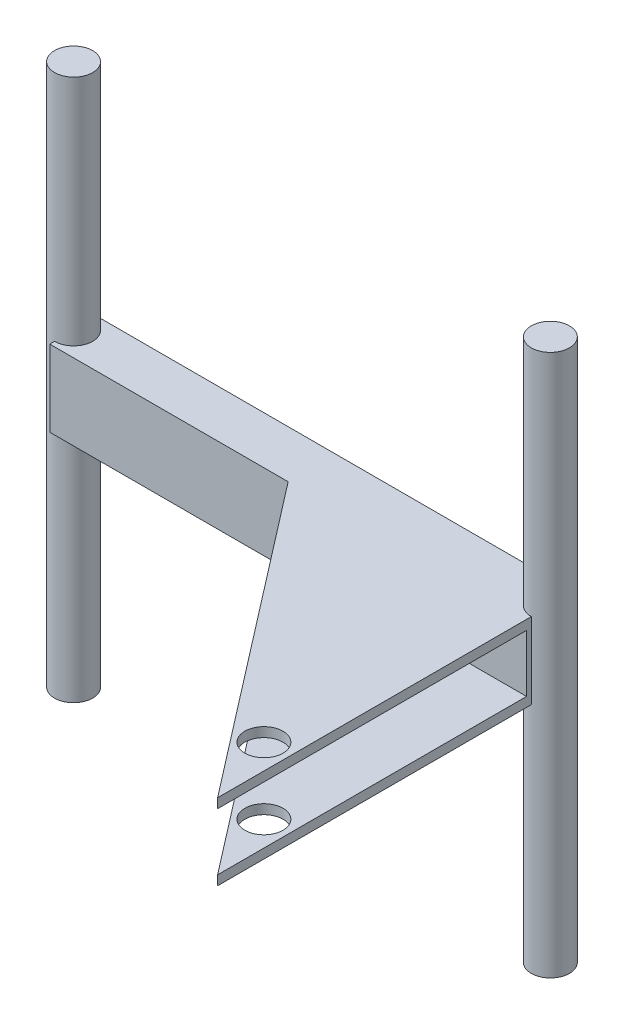
ISO-10303-21;
HEADER;
FILE_DESCRIPTION(('STEP AP214'),'2;1');
FILE_NAME('part.step','',(''),(''),'','','');
FILE_SCHEMA(('AUTOMOTIVE_DESIGN { 1 0 10303 214 1 1 1 1 }'));
ENDSEC;
DATA;
#1=APPLICATION_CONTEXT('core data for automotive mechanical design processes');
#2=APPLICATION_PROTOCOL_DEFINITION('international standard','automotive_design',2000,#1);
#3=PRODUCT_CONTEXT('',#1,'mechanical');
#4=PRODUCT('Part','Part','',(#3));
#5=PRODUCT_RELATED_PRODUCT_CATEGORY('part','',(#4));
#6=PRODUCT_DEFINITION_FORMATION('','',#4);
#7=PRODUCT_DEFINITION_CONTEXT('part definition',#1,'design');
#8=PRODUCT_DEFINITION('design','',#6,#7);
#9=PRODUCT_DEFINITION_SHAPE('','',#8);
#10=(LENGTH_UNIT() NAMED_UNIT(*) SI_UNIT(.MILLI.,.METRE.));
#11=(NAMED_UNIT(*) PLANE_ANGLE_UNIT() SI_UNIT($,.RADIAN.));
#12=(NAMED_UNIT(*) SI_UNIT($,.STERADIAN.) SOLID_ANGLE_UNIT());
#13=UNCERTAINTY_MEASURE_WITH_UNIT(LENGTH_MEASURE(1.E-05),#10,'distance_accuracy_value','');
#14=(GEOMETRIC_REPRESENTATION_CONTEXT(3) GLOBAL_UNCERTAINTY_ASSIGNED_CONTEXT((#13)) GLOBAL_UNIT_ASSIGNED_CONTEXT((#10,
#11,#12)) REPRESENTATION_CONTEXT('',''));
#15=CARTESIAN_POINT('',(0.,0.,0.));
#16=DIRECTION('',(0.,0.,1.));
#17=DIRECTION('',(1.,0.,0.));
#18=AXIS2_PLACEMENT_3D('',#15,#16,#17);
#19=CARTESIAN_POINT('',(-158.590308370044,43.7775330396476,50.));
#20=DIRECTION('',(1.,0.,0.));
#21=DIRECTION('',(0.,1.,0.));
#22=AXIS2_PLACEMENT_3D('',#19,#20,#21);
#23=PLANE('',#22);
#24=DIRECTION('',(0.,0.,-1.));
#25=VECTOR('',#24,1.);
#26=CARTESIAN_POINT('',(-158.590308370044,-36.2224669603524,50.));
#27=LINE('',#26,#25);
#28=CARTESIAN_POINT('',(-158.590308370044,-36.2224669603524,5.00000000000002));
#29=VERTEX_POINT('',#28);
#30=CARTESIAN_POINT('',(-158.590308370044,-36.2224669603524,0.));
#31=VERTEX_POINT('',#30);
#32=EDGE_CURVE('E231',#29,#31,#27,.T.);
#33=ORIENTED_EDGE('',*,*,#32,.F.);
#34=DIRECTION('',(0.,1.,0.));
#35=VECTOR('',#34,1.);
#36=CARTESIAN_POINT('',(-158.590308370044,-280.322466960352,5.00000000000002));
#37=LINE('',#36,#35);
#38=CARTESIAN_POINT('',(-158.590308370044,43.7775330396475,5.00000000000001));
#39=VERTEX_POINT('',#38);
#40=EDGE_CURVE('E195',#29,#39,#37,.T.);
#41=ORIENTED_EDGE('',*,*,#40,.T.);
#42=DIRECTION('',(0.,0.,-1.));
#43=VECTOR('',#42,1.);
#44=CARTESIAN_POINT('',(-158.590308370044,43.7775330396476,50.));
#45=LINE('',#44,#43);
#46=CARTESIAN_POINT('',(-158.590308370044,43.7775330396476,0.));
#47=VERTEX_POINT('',#46);
#48=EDGE_CURVE('E212',#39,#47,#45,.T.);
#49=ORIENTED_EDGE('',*,*,#48,.T.);
#50=DIRECTION('',(0.,-1.,0.));
#51=VECTOR('',#50,1.);
#52=CARTESIAN_POINT('',(-158.590308370044,43.7775330396476,0.));
#53=LINE('',#52,#51);
#54=EDGE_CURVE('E201',#47,#31,#53,.T.);
#55=ORIENTED_EDGE('',*,*,#54,.T.);
#56=EDGE_LOOP('',(#33,#41,#49,#55));
#57=FACE_BOUND('',#56,.T.);
#58=ADVANCED_FACE('F39',(#57),#23,.F.);
#59=CARTESIAN_POINT('',(341.409691629956,43.7775330396476,50.));
#60=DIRECTION('',(-1.,0.,0.));
#61=DIRECTION('',(0.,0.,1.));
#62=AXIS2_PLACEMENT_3D('',#59,#60,#61);
#63=PLANE('',#62);
#64=DIRECTION('',(0.,0.,-1.));
#65=VECTOR('',#64,1.);
#66=CARTESIAN_POINT('',(341.409691629956,-36.2224669603524,50.));
#67=LINE('',#66,#65);
#68=CARTESIAN_POINT('',(341.409691629956,-36.2224669603524,374.));
#69=VERTEX_POINT('',#68);
#70=CARTESIAN_POINT('',(341.409691629956,-36.2224669603524,45.));
#71=VERTEX_POINT('',#70);
#72=EDGE_CURVE('E229',#69,#71,#67,.T.);
#73=ORIENTED_EDGE('',*,*,#72,.T.);
#74=DIRECTION('',(0.,1.,0.));
#75=VECTOR('',#74,1.);
#76=CARTESIAN_POINT('',(341.409691629956,-280.322466960352,45.));
#77=LINE('',#76,#75);
#78=CARTESIAN_POINT('',(341.409691629956,43.7775330396475,45.));
#79=VERTEX_POINT('',#78);
#80=EDGE_CURVE('E187',#71,#79,#77,.T.);
#81=ORIENTED_EDGE('',*,*,#80,.T.);
#82=DIRECTION('',(0.,0.,-1.));
#83=VECTOR('',#82,1.);
#84=CARTESIAN_POINT('',(341.409691629956,43.7775330396476,50.));
#85=LINE('',#84,#83);
#86=CARTESIAN_POINT('',(341.409691629956,43.7775330396476,374.));
#87=VERTEX_POINT('',#86);
#88=EDGE_CURVE('E136',#87,#79,#85,.T.);
#89=ORIENTED_EDGE('',*,*,#88,.F.);
#90=DIRECTION('',(0.,1.,0.));
#91=VECTOR('',#90,1.);
#92=CARTESIAN_POINT('',(341.409691629956,33.7775330396476,374.));
#93=LINE('',#92,#91);
#94=CARTESIAN_POINT('',(341.409691629956,33.7775330396476,374.));
#95=VERTEX_POINT('',#94);
#96=EDGE_CURVE('E129',#95,#87,#93,.T.);
#97=ORIENTED_EDGE('',*,*,#96,.F.);
#98=DIRECTION('',(0.,0.,-1.));
#99=VECTOR('',#98,1.);
#100=CARTESIAN_POINT('',(341.409691629956,33.7775330396476,374.));
#101=LINE('',#100,#99);
#102=CARTESIAN_POINT('',(341.409691629956,33.7775330396476,50.));
#103=VERTEX_POINT('',#102);
#104=EDGE_CURVE('E133',#95,#103,#101,.T.);
#105=ORIENTED_EDGE('',*,*,#104,.T.);
#106=DIRECTION('',(0.,1.,0.));
#107=VECTOR('',#106,1.);
#108=CARTESIAN_POINT('',(341.409691629956,43.7775330396476,50.));
#109=LINE('',#108,#107);
#110=CARTESIAN_POINT('',(341.409691629956,-26.2224669603524,50.));
#111=VERTEX_POINT('',#110);
#112=EDGE_CURVE('E60',#111,#103,#109,.T.);
#113=ORIENTED_EDGE('',*,*,#112,.F.);
#114=DIRECTION('',(0.,0.,1.));
#115=VECTOR('',#114,1.);
#116=CARTESIAN_POINT('',(341.409691629956,-26.2224669603524,50.));
#117=LINE('',#116,#115);
#118=CARTESIAN_POINT('',(341.409691629956,-26.2224669603524,374.));
#119=VERTEX_POINT('',#118);
#120=EDGE_CURVE('E159',#111,#119,#117,.T.);
#121=ORIENTED_EDGE('',*,*,#120,.T.);
#122=DIRECTION('',(0.,-1.,0.));
#123=VECTOR('',#122,1.);
#124=CARTESIAN_POINT('',(341.409691629956,-26.2224669603524,374.));
#125=LINE('',#124,#123);
#126=EDGE_CURVE('E165',#119,#69,#125,.T.);
#127=ORIENTED_EDGE('',*,*,#126,.T.);
#128=EDGE_LOOP('',(#73,#81,#89,#97,#105,#113,#121,#127));
#129=FACE_BOUND('',#128,.T.);
#130=ADVANCED_FACE('F132',(#129),#63,.F.);
#131=CARTESIAN_POINT('',(-158.590308370044,43.7775330396476,50.));
#132=VERTEX_POINT('',#131);
#133=CARTESIAN_POINT('',(-158.590308370044,43.7775330396475,45.));
#134=VERTEX_POINT('',#133);
#135=EDGE_CURVE('E223',#132,#134,#45,.T.);
#136=ORIENTED_EDGE('',*,*,#135,.T.);
#137=DIRECTION('',(0.,1.,0.));
#138=VECTOR('',#137,1.);
#139=CARTESIAN_POINT('',(-158.590308370044,-280.322466960352,45.));
#140=LINE('',#139,#138);
#141=CARTESIAN_POINT('',(-158.590308370044,-36.2224669603524,45.));
#142=VERTEX_POINT('',#141);
#143=EDGE_CURVE('E192',#134,#142,#140,.F.);
#144=ORIENTED_EDGE('',*,*,#143,.T.);
#145=CARTESIAN_POINT('',(-158.590308370044,-36.2224669603524,50.));
#146=VERTEX_POINT('',#145);
#147=EDGE_CURVE('E232',#146,#142,#27,.T.);
#148=ORIENTED_EDGE('',*,*,#147,.F.);
#149=DIRECTION('',(0.,-1.,0.));
#150=VECTOR('',#149,1.);
#151=CARTESIAN_POINT('',(-158.590308370044,43.7775330396476,50.));
#152=LINE('',#151,#150);
#153=EDGE_CURVE('E202',#132,#146,#152,.T.);
#154=ORIENTED_EDGE('',*,*,#153,.F.);
#155=EDGE_LOOP('',(#136,#144,#148,#154));
#156=FACE_BOUND('',#155,.T.);
#157=ADVANCED_FACE('F41',(#156),#23,.F.);
#158=CARTESIAN_POINT('',(-158.590308370044,-36.2224669603524,50.));
#159=DIRECTION('',(0.,1.,0.));
#160=DIRECTION('',(0.,0.,1.));
#161=AXIS2_PLACEMENT_3D('',#158,#159,#160);
#162=PLANE('',#161);
#163=CARTESIAN_POINT('',(315.24921843978,-36.2224669603524,299.249641509486));
#164=DIRECTION('',(0.,1.,0.));
#165=DIRECTION('',(0.,0.,1.));
#166=AXIS2_PLACEMENT_3D('',#163,#164,#165);
#167=CIRCLE('',#166,20.);
#168=CARTESIAN_POINT('',(315.24921843978,-36.2224669603524,319.249641509486));
#169=VERTEX_POINT('',#168);
#170=EDGE_CURVE('E155',#169,#169,#167,.T.);
#171=ORIENTED_EDGE('',*,*,#170,.T.);
#172=EDGE_LOOP('',(#171));
#173=FACE_BOUND('',#172,.T.);
#174=ORIENTED_EDGE('',*,*,#147,.T.);
#175=CARTESIAN_POINT('',(-158.590308370044,-36.2224669603524,25.));
#176=DIRECTION('',(0.,1.,0.));
#177=DIRECTION('',(0.,0.,1.));
#178=AXIS2_PLACEMENT_3D('',#175,#176,#177);
#179=CIRCLE('',#178,20.);
#180=EDGE_CURVE('E198',#142,#29,#179,.T.);
#181=ORIENTED_EDGE('',*,*,#180,.T.);
#182=ORIENTED_EDGE('',*,*,#32,.T.);
#183=DIRECTION('',(1.,0.,0.));
#184=VECTOR('',#183,1.);
#185=CARTESIAN_POINT('',(-158.590308370044,-36.2224669603524,0.));
#186=LINE('',#185,#184);
#187=CARTESIAN_POINT('',(341.409691629956,-36.2224669603524,0.));
#188=VERTEX_POINT('',#187);
#189=EDGE_CURVE('E215',#31,#188,#186,.T.);
#190=ORIENTED_EDGE('',*,*,#189,.T.);
#191=CARTESIAN_POINT('',(341.409691629956,-36.2224669603524,4.99999999999999));
#192=VERTEX_POINT('',#191);
#193=EDGE_CURVE('E228',#192,#188,#67,.T.);
#194=ORIENTED_EDGE('',*,*,#193,.F.);
#195=CARTESIAN_POINT('',(341.409691629956,-36.2224669603524,25.));
#196=DIRECTION('',(0.,1.,0.));
#197=DIRECTION('',(0.,0.,1.));
#198=AXIS2_PLACEMENT_3D('',#195,#196,#197);
#199=CIRCLE('',#198,20.);
#200=EDGE_CURVE('E189',#192,#71,#199,.T.);
#201=ORIENTED_EDGE('',*,*,#200,.T.);
#202=ORIENTED_EDGE('',*,*,#72,.F.);
#203=DIRECTION('',(-0.610890988673913,0.,-0.791714721321392));
#204=VECTOR('',#203,1.);
#205=CARTESIAN_POINT('',(341.409691629956,-36.2224669603524,374.));
#206=LINE('',#205,#204);
#207=CARTESIAN_POINT('',(91.4096916299559,-36.2224669603524,50.));
#208=VERTEX_POINT('',#207);
#209=EDGE_CURVE('E141',#69,#208,#206,.T.);
#210=ORIENTED_EDGE('',*,*,#209,.T.);
#211=DIRECTION('',(1.,0.,0.));
#212=VECTOR('',#211,1.);
#213=CARTESIAN_POINT('',(-158.590308370044,-36.2224669603524,50.));
#214=LINE('',#213,#212);
#215=EDGE_CURVE('E205',#146,#208,#214,.T.);
#216=ORIENTED_EDGE('',*,*,#215,.F.);
#217=EDGE_LOOP('',(#174,#181,#182,#190,#194,#201,#202,#210,#216));
#218=FACE_BOUND('',#217,.T.);
#219=ADVANCED_FACE('F256',(#173,#218),#162,.F.);
#220=CARTESIAN_POINT('',(341.409691629956,43.7775330396475,4.99999999999998));
#221=VERTEX_POINT('',#220);
#222=CARTESIAN_POINT('',(341.409691629956,43.7775330396476,0.));
#223=VERTEX_POINT('',#222);
#224=EDGE_CURVE('E226',#221,#223,#85,.T.);
#225=ORIENTED_EDGE('',*,*,#224,.F.);
#226=DIRECTION('',(0.,1.,0.));
#227=VECTOR('',#226,1.);
#228=CARTESIAN_POINT('',(341.409691629956,-280.322466960352,4.99999999999999));
#229=LINE('',#228,#227);
#230=EDGE_CURVE('E180',#221,#192,#229,.F.);
#231=ORIENTED_EDGE('',*,*,#230,.T.);
#232=ORIENTED_EDGE('',*,*,#193,.T.);
#233=DIRECTION('',(0.,1.,0.));
#234=VECTOR('',#233,1.);
#235=CARTESIAN_POINT('',(341.409691629956,43.7775330396476,0.));
#236=LINE('',#235,#234);
#237=EDGE_CURVE('E218',#188,#223,#236,.T.);
#238=ORIENTED_EDGE('',*,*,#237,.T.);
#239=EDGE_LOOP('',(#225,#231,#232,#238));
#240=FACE_BOUND('',#239,.T.);
#241=ADVANCED_FACE('F242',(#240),#63,.F.);
#242=CARTESIAN_POINT('',(-158.590308370044,43.7775330396476,50.));
#243=DIRECTION('',(0.,-1.,0.));
#244=DIRECTION('',(0.,0.,-1.));
#245=AXIS2_PLACEMENT_3D('',#242,#243,#244);
#246=PLANE('',#245);
#247=CARTESIAN_POINT('',(315.24921843978,43.7775330396476,299.249641509486));
#248=DIRECTION('',(0.,-1.,0.));
#249=DIRECTION('',(0.,0.,-1.));
#250=AXIS2_PLACEMENT_3D('',#247,#248,#249);
#251=CIRCLE('',#250,20.);
#252=CARTESIAN_POINT('',(315.24921843978,43.7775330396476,279.249641509486));
#253=VERTEX_POINT('',#252);
#254=EDGE_CURVE('E289',#253,#253,#251,.T.);
#255=ORIENTED_EDGE('',*,*,#254,.T.);
#256=EDGE_LOOP('',(#255));
#257=FACE_BOUND('',#256,.T.);
#258=ORIENTED_EDGE('',*,*,#48,.F.);
#259=CARTESIAN_POINT('',(-158.590308370044,43.7775330396475,25.));
#260=DIRECTION('',(0.,-1.,0.));
#261=DIRECTION('',(0.,0.,-1.));
#262=AXIS2_PLACEMENT_3D('',#259,#260,#261);
#263=CIRCLE('',#262,20.);
#264=EDGE_CURVE('E11',#39,#134,#263,.T.);
#265=ORIENTED_EDGE('',*,*,#264,.T.);
#266=ORIENTED_EDGE('',*,*,#135,.F.);
#267=DIRECTION('',(-1.,0.,0.));
#268=VECTOR('',#267,1.);
#269=CARTESIAN_POINT('',(-158.590308370044,43.7775330396476,50.));
#270=LINE('',#269,#268);
#271=CARTESIAN_POINT('',(91.4096916299559,43.7775330396476,50.));
#272=VERTEX_POINT('',#271);
#273=EDGE_CURVE('E210',#272,#132,#270,.T.);
#274=ORIENTED_EDGE('',*,*,#273,.F.);
#275=DIRECTION('',(0.610890988673913,0.,0.791714721321392));
#276=VECTOR('',#275,1.);
#277=CARTESIAN_POINT('',(91.4096916299559,43.7775330396476,50.));
#278=LINE('',#277,#276);
#279=EDGE_CURVE('E148',#272,#87,#278,.T.);
#280=ORIENTED_EDGE('',*,*,#279,.T.);
#281=ORIENTED_EDGE('',*,*,#88,.T.);
#282=CARTESIAN_POINT('',(341.409691629956,43.7775330396475,25.));
#283=DIRECTION('',(0.,-1.,0.));
#284=DIRECTION('',(0.,0.,-1.));
#285=AXIS2_PLACEMENT_3D('',#282,#283,#284);
#286=CIRCLE('',#285,20.);
#287=EDGE_CURVE('E48',#79,#221,#286,.T.);
#288=ORIENTED_EDGE('',*,*,#287,.T.);
#289=ORIENTED_EDGE('',*,*,#224,.T.);
#290=DIRECTION('',(-1.,0.,0.));
#291=VECTOR('',#290,1.);
#292=CARTESIAN_POINT('',(-158.590308370044,43.7775330396476,0.));
#293=LINE('',#292,#291);
#294=EDGE_CURVE('E206',#223,#47,#293,.T.);
#295=ORIENTED_EDGE('',*,*,#294,.T.);
#296=EDGE_LOOP('',(#258,#265,#266,#274,#280,#281,#288,#289,#295));
#297=FACE_BOUND('',#296,.T.);
#298=ADVANCED_FACE('F239',(#257,#297),#246,.F.);
#299=CARTESIAN_POINT('',(0.,0.,50.));
#300=DIRECTION('',(0.,0.,1.));
#301=DIRECTION('',(1.,0.,0.));
#302=AXIS2_PLACEMENT_3D('',#299,#300,#301);
#303=PLANE('',#302);
#304=DIRECTION('',(0.,1.,0.));
#305=VECTOR('',#304,1.);
#306=CARTESIAN_POINT('',(91.4096916299559,33.7775330396476,50.));
#307=LINE('',#306,#305);
#308=CARTESIAN_POINT('',(91.4096916299559,33.7775330396476,50.));
#309=VERTEX_POINT('',#308);
#310=EDGE_CURVE('E142',#309,#272,#307,.T.);
#311=ORIENTED_EDGE('',*,*,#310,.T.);
#312=ORIENTED_EDGE('',*,*,#273,.T.);
#313=ORIENTED_EDGE('',*,*,#153,.T.);
#314=ORIENTED_EDGE('',*,*,#215,.T.);
#315=DIRECTION('',(0.,-1.,0.));
#316=VECTOR('',#315,1.);
#317=CARTESIAN_POINT('',(91.4096916299559,-26.2224669603524,50.));
#318=LINE('',#317,#316);
#319=CARTESIAN_POINT('',(91.4096916299559,-26.2224669603524,50.));
#320=VERTEX_POINT('',#319);
#321=EDGE_CURVE('E168',#320,#208,#318,.T.);
#322=ORIENTED_EDGE('',*,*,#321,.F.);
#323=DIRECTION('',(1.,0.,0.));
#324=VECTOR('',#323,1.);
#325=CARTESIAN_POINT('',(91.4096916299559,-26.2224669603524,50.));
#326=LINE('',#325,#324);
#327=EDGE_CURVE('E157',#320,#111,#326,.T.);
#328=ORIENTED_EDGE('',*,*,#327,.T.);
#329=ORIENTED_EDGE('',*,*,#112,.T.);
#330=DIRECTION('',(-1.,0.,0.));
#331=VECTOR('',#330,1.);
#332=CARTESIAN_POINT('',(341.409691629956,33.7775330396476,50.));
#333=LINE('',#332,#331);
#334=EDGE_CURVE('E55',#103,#309,#333,.T.);
#335=ORIENTED_EDGE('',*,*,#334,.T.);
#336=EDGE_LOOP('',(#311,#312,#313,#314,#322,#328,#329,#335));
#337=FACE_BOUND('',#336,.T.);
#338=ADVANCED_FACE('F260',(#337),#303,.T.);
#339=CARTESIAN_POINT('',(0.,0.,0.));
#340=DIRECTION('',(0.,0.,1.));
#341=DIRECTION('',(1.,0.,0.));
#342=AXIS2_PLACEMENT_3D('',#339,#340,#341);
#343=PLANE('',#342);
#344=ORIENTED_EDGE('',*,*,#54,.F.);
#345=ORIENTED_EDGE('',*,*,#294,.F.);
#346=ORIENTED_EDGE('',*,*,#237,.F.);
#347=ORIENTED_EDGE('',*,*,#189,.F.);
#348=EDGE_LOOP('',(#344,#345,#346,#347));
#349=FACE_BOUND('',#348,.T.);
#350=ADVANCED_FACE('F249',(#349),#343,.F.);
#351=CARTESIAN_POINT('',(341.409691629956,-280.322466960352,25.));
#352=DIRECTION('',(0.,1.,0.));
#353=DIRECTION('',(0.,0.,1.));
#354=AXIS2_PLACEMENT_3D('',#351,#352,#353);
#355=CYLINDRICAL_SURFACE('',#354,20.);
#356=CARTESIAN_POINT('',(341.409691629956,287.877533039648,25.));
#357=DIRECTION('',(0.,1.,0.));
#358=DIRECTION('',(0.,0.,1.));
#359=AXIS2_PLACEMENT_3D('',#356,#357,#358);
#360=CIRCLE('',#359,20.);
#361=CARTESIAN_POINT('',(341.409691629956,287.877533039648,45.));
#362=VERTEX_POINT('',#361);
#363=EDGE_CURVE('E177',#362,#362,#360,.T.);
#364=ORIENTED_EDGE('',*,*,#363,.F.);
#365=EDGE_LOOP('',(#364));
#366=FACE_BOUND('',#365,.T.);
#367=CARTESIAN_POINT('',(341.409691629956,-280.322466960352,25.));
#368=DIRECTION('',(0.,1.,0.));
#369=DIRECTION('',(0.,0.,1.));
#370=AXIS2_PLACEMENT_3D('',#367,#368,#369);
#371=CIRCLE('',#370,20.);
#372=CARTESIAN_POINT('',(341.409691629956,-280.322466960352,45.));
#373=VERTEX_POINT('',#372);
#374=EDGE_CURVE('E170',#373,#373,#371,.T.);
#375=ORIENTED_EDGE('',*,*,#374,.T.);
#376=EDGE_LOOP('',(#375));
#377=FACE_BOUND('',#376,.T.);
#378=ORIENTED_EDGE('',*,*,#200,.F.);
#379=ORIENTED_EDGE('',*,*,#230,.F.);
#380=ORIENTED_EDGE('',*,*,#287,.F.);
#381=ORIENTED_EDGE('',*,*,#80,.F.);
#382=EDGE_LOOP('',(#378,#379,#380,#381));
#383=FACE_BOUND('',#382,.T.);
#384=ADVANCED_FACE('F268',(#366,#377,#383),#355,.T.);
#385=CARTESIAN_POINT('',(341.409691629956,-280.322466960352,25.));
#386=DIRECTION('',(0.,1.,0.));
#387=DIRECTION('',(0.,0.,1.));
#388=AXIS2_PLACEMENT_3D('',#385,#386,#387);
#389=PLANE('',#388);
#390=ORIENTED_EDGE('',*,*,#374,.F.);
#391=EDGE_LOOP('',(#390));
#392=FACE_BOUND('',#391,.T.);
#393=ADVANCED_FACE('F337',(#392),#389,.F.);
#394=CARTESIAN_POINT('',(341.409691629956,287.877533039648,25.));
#395=DIRECTION('',(0.,1.,0.));
#396=DIRECTION('',(0.,0.,1.));
#397=AXIS2_PLACEMENT_3D('',#394,#395,#396);
#398=PLANE('',#397);
#399=ORIENTED_EDGE('',*,*,#363,.T.);
#400=EDGE_LOOP('',(#399));
#401=FACE_BOUND('',#400,.T.);
#402=ADVANCED_FACE('F333',(#401),#398,.T.);
#403=CARTESIAN_POINT('',(-158.590308370044,-280.322466960352,25.));
#404=DIRECTION('',(0.,1.,0.));
#405=DIRECTION('',(0.,0.,1.));
#406=AXIS2_PLACEMENT_3D('',#403,#404,#405);
#407=CYLINDRICAL_SURFACE('',#406,20.);
#408=CARTESIAN_POINT('',(-158.590308370044,287.877533039648,25.));
#409=DIRECTION('',(0.,1.,0.));
#410=DIRECTION('',(0.,0.,1.));
#411=AXIS2_PLACEMENT_3D('',#408,#409,#410);
#412=CIRCLE('',#411,20.);
#413=CARTESIAN_POINT('',(-158.590308370044,287.877533039648,45.));
#414=VERTEX_POINT('',#413);
#415=EDGE_CURVE('E173',#414,#414,#412,.T.);
#416=ORIENTED_EDGE('',*,*,#415,.F.);
#417=EDGE_LOOP('',(#416));
#418=FACE_BOUND('',#417,.T.);
#419=CARTESIAN_POINT('',(-158.590308370044,-280.322466960352,25.));
#420=DIRECTION('',(0.,1.,0.));
#421=DIRECTION('',(0.,0.,1.));
#422=AXIS2_PLACEMENT_3D('',#419,#420,#421);
#423=CIRCLE('',#422,20.);
#424=CARTESIAN_POINT('',(-158.590308370044,-280.322466960352,45.));
#425=VERTEX_POINT('',#424);
#426=EDGE_CURVE('E176',#425,#425,#423,.T.);
#427=ORIENTED_EDGE('',*,*,#426,.T.);
#428=EDGE_LOOP('',(#427));
#429=FACE_BOUND('',#428,.T.);
#430=ORIENTED_EDGE('',*,*,#180,.F.);
#431=ORIENTED_EDGE('',*,*,#143,.F.);
#432=ORIENTED_EDGE('',*,*,#264,.F.);
#433=ORIENTED_EDGE('',*,*,#40,.F.);
#434=EDGE_LOOP('',(#430,#431,#432,#433));
#435=FACE_BOUND('',#434,.T.);
#436=ADVANCED_FACE('F254',(#418,#429,#435),#407,.T.);
#437=CARTESIAN_POINT('',(-158.590308370044,-280.322466960352,25.));
#438=DIRECTION('',(0.,1.,0.));
#439=DIRECTION('',(0.,0.,1.));
#440=AXIS2_PLACEMENT_3D('',#437,#438,#439);
#441=PLANE('',#440);
#442=ORIENTED_EDGE('',*,*,#426,.F.);
#443=EDGE_LOOP('',(#442));
#444=FACE_BOUND('',#443,.T.);
#445=ADVANCED_FACE('F326',(#444),#441,.F.);
#446=CARTESIAN_POINT('',(-158.590308370044,287.877533039648,25.));
#447=DIRECTION('',(0.,1.,0.));
#448=DIRECTION('',(0.,0.,1.));
#449=AXIS2_PLACEMENT_3D('',#446,#447,#448);
#450=PLANE('',#449);
#451=ORIENTED_EDGE('',*,*,#415,.T.);
#452=EDGE_LOOP('',(#451));
#453=FACE_BOUND('',#452,.T.);
#454=ADVANCED_FACE('F322',(#453),#450,.T.);
#455=CARTESIAN_POINT('',(341.409691629956,-26.2224669603524,374.));
#456=DIRECTION('',(-0.791714721321392,0.,0.610890988673913));
#457=DIRECTION('',(0.610890988673913,0.,0.791714721321392));
#458=AXIS2_PLACEMENT_3D('',#455,#456,#457);
#459=PLANE('',#458);
#460=ORIENTED_EDGE('',*,*,#209,.F.);
#461=ORIENTED_EDGE('',*,*,#126,.F.);
#462=DIRECTION('',(-0.610890988673913,0.,-0.791714721321392));
#463=VECTOR('',#462,1.);
#464=CARTESIAN_POINT('',(341.409691629956,-26.2224669603524,374.));
#465=LINE('',#464,#463);
#466=EDGE_CURVE('E162',#119,#320,#465,.T.);
#467=ORIENTED_EDGE('',*,*,#466,.T.);
#468=ORIENTED_EDGE('',*,*,#321,.T.);
#469=EDGE_LOOP('',(#460,#461,#467,#468));
#470=FACE_BOUND('',#469,.T.);
#471=ADVANCED_FACE('F319',(#470),#459,.T.);
#472=CARTESIAN_POINT('',(0.,-26.2224669603524,0.));
#473=DIRECTION('',(0.,-1.,0.));
#474=DIRECTION('',(0.,0.,-1.));
#475=AXIS2_PLACEMENT_3D('',#472,#473,#474);
#476=PLANE('',#475);
#477=CARTESIAN_POINT('',(315.24921843978,-26.2224669603525,299.249641509486));
#478=DIRECTION('',(0.,-1.,0.));
#479=DIRECTION('',(0.,0.,-1.));
#480=AXIS2_PLACEMENT_3D('',#477,#478,#479);
#481=CIRCLE('',#480,20.);
#482=CARTESIAN_POINT('',(315.24921843978,-26.2224669603525,279.249641509486));
#483=VERTEX_POINT('',#482);
#484=EDGE_CURVE('E292',#483,#483,#481,.T.);
#485=ORIENTED_EDGE('',*,*,#484,.T.);
#486=EDGE_LOOP('',(#485));
#487=FACE_BOUND('',#486,.T.);
#488=ORIENTED_EDGE('',*,*,#327,.F.);
#489=ORIENTED_EDGE('',*,*,#466,.F.);
#490=ORIENTED_EDGE('',*,*,#120,.F.);
#491=EDGE_LOOP('',(#488,#489,#490));
#492=FACE_BOUND('',#491,.T.);
#493=ADVANCED_FACE('F316',(#487,#492),#476,.F.);
#494=CARTESIAN_POINT('',(91.4096916299559,33.7775330396476,50.));
#495=DIRECTION('',(-0.791714721321391,0.,0.610890988673913));
#496=DIRECTION('',(0.610890988673913,0.,0.791714721321392));
#497=AXIS2_PLACEMENT_3D('',#494,#495,#496);
#498=PLANE('',#497);
#499=ORIENTED_EDGE('',*,*,#279,.F.);
#500=ORIENTED_EDGE('',*,*,#310,.F.);
#501=DIRECTION('',(0.610890988673913,0.,0.791714721321392));
#502=VECTOR('',#501,1.);
#503=CARTESIAN_POINT('',(91.4096916299559,33.7775330396476,50.));
#504=LINE('',#503,#502);
#505=EDGE_CURVE('E147',#309,#95,#504,.T.);
#506=ORIENTED_EDGE('',*,*,#505,.T.);
#507=ORIENTED_EDGE('',*,*,#96,.T.);
#508=EDGE_LOOP('',(#499,#500,#506,#507));
#509=FACE_BOUND('',#508,.T.);
#510=ADVANCED_FACE('F150',(#509),#498,.T.);
#511=CARTESIAN_POINT('',(0.,33.7775330396476,0.));
#512=DIRECTION('',(0.,1.,0.));
#513=DIRECTION('',(0.,0.,1.));
#514=AXIS2_PLACEMENT_3D('',#511,#512,#513);
#515=PLANE('',#514);
#516=CARTESIAN_POINT('',(315.24921843978,33.7775330396476,299.249641509486));
#517=DIRECTION('',(0.,1.,0.));
#518=DIRECTION('',(0.,0.,1.));
#519=AXIS2_PLACEMENT_3D('',#516,#517,#518);
#520=CIRCLE('',#519,20.);
#521=CARTESIAN_POINT('',(315.24921843978,33.7775330396476,319.249641509486));
#522=VERTEX_POINT('',#521);
#523=EDGE_CURVE('E43',#522,#522,#520,.T.);
#524=ORIENTED_EDGE('',*,*,#523,.T.);
#525=EDGE_LOOP('',(#524));
#526=FACE_BOUND('',#525,.T.);
#527=ORIENTED_EDGE('',*,*,#104,.F.);
#528=ORIENTED_EDGE('',*,*,#505,.F.);
#529=ORIENTED_EDGE('',*,*,#334,.F.);
#530=EDGE_LOOP('',(#527,#528,#529));
#531=FACE_BOUND('',#530,.T.);
#532=ADVANCED_FACE('F146',(#526,#531),#515,.F.);
#533=CARTESIAN_POINT('',(315.24921843978,287.877533039648,299.249641509486));
#534=DIRECTION('',(0.,-1.,0.));
#535=DIRECTION('',(0.,0.,-1.));
#536=AXIS2_PLACEMENT_3D('',#533,#534,#535);
#537=CYLINDRICAL_SURFACE('',#536,20.);
#538=ORIENTED_EDGE('',*,*,#523,.F.);
#539=EDGE_LOOP('',(#538));
#540=FACE_BOUND('',#539,.T.);
#541=ORIENTED_EDGE('',*,*,#254,.F.);
#542=EDGE_LOOP('',(#541));
#543=FACE_BOUND('',#542,.T.);
#544=ADVANCED_FACE('F302',(#540,#543),#537,.F.);
#545=ORIENTED_EDGE('',*,*,#484,.F.);
#546=EDGE_LOOP('',(#545));
#547=FACE_BOUND('',#546,.T.);
#548=ORIENTED_EDGE('',*,*,#170,.F.);
#549=EDGE_LOOP('',(#548));
#550=FACE_BOUND('',#549,.T.);
#551=ADVANCED_FACE('F305',(#547,#550),#537,.F.);
#552=CLOSED_SHELL('',(#58,#130,#157,#219,#241,#298,#338,#350,#384,#393,#402,#436,#445,#454,#471,
#493,#510,#532,#544,#551));
#553=MANIFOLD_SOLID_BREP('B2',#552);
#554=ADVANCED_BREP_SHAPE_REPRESENTATION('',(#18,#553),#14);
#555=SHAPE_DEFINITION_REPRESENTATION(#9,#554);
ENDSEC;
END-ISO-10303-21;
